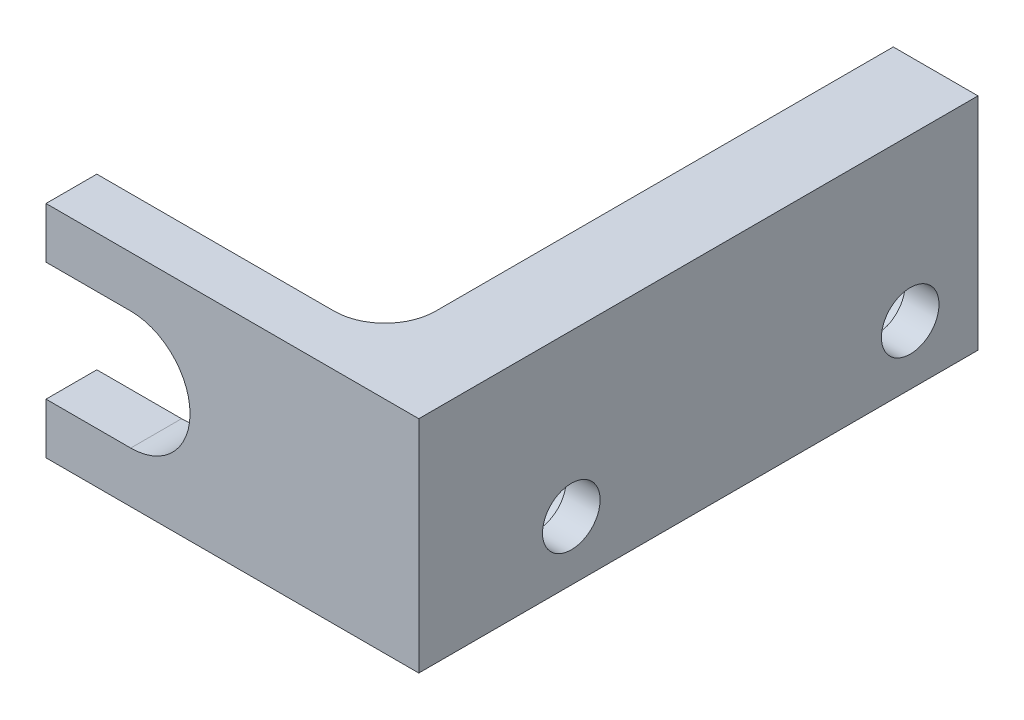
ISO-10303-21;
HEADER;
FILE_DESCRIPTION(('STEP AP214'),'2;1');
FILE_NAME('part.step','',(''),(''),'','','');
FILE_SCHEMA(('AUTOMOTIVE_DESIGN { 1 0 10303 214 1 1 1 1 }'));
ENDSEC;
DATA;
#1=APPLICATION_CONTEXT('core data for automotive mechanical design processes');
#2=APPLICATION_PROTOCOL_DEFINITION('international standard','automotive_design',2000,#1);
#3=PRODUCT_CONTEXT('',#1,'mechanical');
#4=PRODUCT('Part','Part','',(#3));
#5=PRODUCT_RELATED_PRODUCT_CATEGORY('part','',(#4));
#6=PRODUCT_DEFINITION_FORMATION('','',#4);
#7=PRODUCT_DEFINITION_CONTEXT('part definition',#1,'design');
#8=PRODUCT_DEFINITION('design','',#6,#7);
#9=PRODUCT_DEFINITION_SHAPE('','',#8);
#10=(LENGTH_UNIT() NAMED_UNIT(*) SI_UNIT(.MILLI.,.METRE.));
#11=(NAMED_UNIT(*) PLANE_ANGLE_UNIT() SI_UNIT($,.RADIAN.));
#12=(NAMED_UNIT(*) SI_UNIT($,.STERADIAN.) SOLID_ANGLE_UNIT());
#13=UNCERTAINTY_MEASURE_WITH_UNIT(LENGTH_MEASURE(1.E-05),#10,'distance_accuracy_value','');
#14=(GEOMETRIC_REPRESENTATION_CONTEXT(3) GLOBAL_UNCERTAINTY_ASSIGNED_CONTEXT((#13)) GLOBAL_UNIT_ASSIGNED_CONTEXT((#10,
#11,#12)) REPRESENTATION_CONTEXT('',''));
#15=CARTESIAN_POINT('',(0.,0.,0.));
#16=DIRECTION('',(0.,0.,1.));
#17=DIRECTION('',(1.,0.,0.));
#18=AXIS2_PLACEMENT_3D('',#15,#16,#17);
#19=CARTESIAN_POINT('',(-11.,-6.5,33.));
#20=DIRECTION('',(1.,0.,0.));
#21=DIRECTION('',(0.,0.,-1.));
#22=AXIS2_PLACEMENT_3D('',#19,#20,#21);
#23=PLANE('',#22);
#24=DIRECTION('',(0.,-1.,0.));
#25=VECTOR('',#24,1.);
#26=CARTESIAN_POINT('',(-11.,-6.5,33.));
#27=LINE('',#26,#25);
#28=CARTESIAN_POINT('',(-11.,-3.5,33.));
#29=VERTEX_POINT('',#28);
#30=CARTESIAN_POINT('',(-11.,-6.5,33.));
#31=VERTEX_POINT('',#30);
#32=EDGE_CURVE('E206',#29,#31,#27,.T.);
#33=ORIENTED_EDGE('',*,*,#32,.F.);
#34=DIRECTION('',(0.,0.,1.));
#35=VECTOR('',#34,1.);
#36=CARTESIAN_POINT('',(-11.,-3.5,0.));
#37=LINE('',#36,#35);
#38=CARTESIAN_POINT('',(-11.,-3.5,30.));
#39=VERTEX_POINT('',#38);
#40=EDGE_CURVE('E158',#39,#29,#37,.T.);
#41=ORIENTED_EDGE('',*,*,#40,.F.);
#42=DIRECTION('',(0.,1.,0.));
#43=VECTOR('',#42,1.);
#44=CARTESIAN_POINT('',(-11.,6.5,30.));
#45=LINE('',#44,#43);
#46=CARTESIAN_POINT('',(-11.,-6.5,30.));
#47=VERTEX_POINT('',#46);
#48=EDGE_CURVE('E192',#47,#39,#45,.T.);
#49=ORIENTED_EDGE('',*,*,#48,.F.);
#50=DIRECTION('',(0.,0.,-1.));
#51=VECTOR('',#50,1.);
#52=CARTESIAN_POINT('',(-11.,-6.5,33.));
#53=LINE('',#52,#51);
#54=EDGE_CURVE('E219',#31,#47,#53,.T.);
#55=ORIENTED_EDGE('',*,*,#54,.F.);
#56=EDGE_LOOP('',(#33,#41,#49,#55));
#57=FACE_BOUND('',#56,.T.);
#58=ADVANCED_FACE('F43',(#57),#23,.F.);
#59=CARTESIAN_POINT('',(0.,0.,0.));
#60=DIRECTION('',(0.,0.,-1.));
#61=DIRECTION('',(-1.,0.,0.));
#62=AXIS2_PLACEMENT_3D('',#59,#60,#61);
#63=PLANE('',#62);
#64=DIRECTION('',(1.,0.,0.));
#65=VECTOR('',#64,1.);
#66=CARTESIAN_POINT('',(-11.,-6.5,0.));
#67=LINE('',#66,#65);
#68=CARTESIAN_POINT('',(6.,-6.5,0.));
#69=VERTEX_POINT('',#68);
#70=CARTESIAN_POINT('',(11.,-6.5,0.));
#71=VERTEX_POINT('',#70);
#72=EDGE_CURVE('E204',#69,#71,#67,.T.);
#73=ORIENTED_EDGE('',*,*,#72,.F.);
#74=DIRECTION('',(0.,1.,0.));
#75=VECTOR('',#74,1.);
#76=CARTESIAN_POINT('',(6.,6.5,0.));
#77=LINE('',#76,#75);
#78=CARTESIAN_POINT('',(6.,6.5,0.));
#79=VERTEX_POINT('',#78);
#80=EDGE_CURVE('E187',#69,#79,#77,.T.);
#81=ORIENTED_EDGE('',*,*,#80,.T.);
#82=DIRECTION('',(-1.,0.,0.));
#83=VECTOR('',#82,1.);
#84=CARTESIAN_POINT('',(-11.,6.5,0.));
#85=LINE('',#84,#83);
#86=CARTESIAN_POINT('',(11.,6.5,0.));
#87=VERTEX_POINT('',#86);
#88=EDGE_CURVE('E213',#87,#79,#85,.T.);
#89=ORIENTED_EDGE('',*,*,#88,.F.);
#90=DIRECTION('',(0.,1.,0.));
#91=VECTOR('',#90,1.);
#92=CARTESIAN_POINT('',(11.,-6.5,0.));
#93=LINE('',#92,#91);
#94=EDGE_CURVE('E199',#71,#87,#93,.T.);
#95=ORIENTED_EDGE('',*,*,#94,.F.);
#96=EDGE_LOOP('',(#73,#81,#89,#95));
#97=FACE_BOUND('',#96,.T.);
#98=ADVANCED_FACE('F261',(#97),#63,.T.);
#99=CARTESIAN_POINT('',(11.,-6.5,33.));
#100=DIRECTION('',(-1.,0.,0.));
#101=DIRECTION('',(0.,0.,1.));
#102=AXIS2_PLACEMENT_3D('',#99,#100,#101);
#103=PLANE('',#102);
#104=CARTESIAN_POINT('',(11.,-3.,24.));
#105=DIRECTION('',(-1.,0.,0.));
#106=DIRECTION('',(0.,0.,1.));
#107=AXIS2_PLACEMENT_3D('',#104,#105,#106);
#108=CIRCLE('',#107,1.7);
#109=CARTESIAN_POINT('',(11.,-3.,25.7));
#110=VERTEX_POINT('',#109);
#111=EDGE_CURVE('E169',#110,#110,#108,.T.);
#112=ORIENTED_EDGE('',*,*,#111,.T.);
#113=EDGE_LOOP('',(#112));
#114=FACE_BOUND('',#113,.T.);
#115=CARTESIAN_POINT('',(11.,-3.,4.));
#116=DIRECTION('',(-1.,0.,0.));
#117=DIRECTION('',(0.,0.,1.));
#118=AXIS2_PLACEMENT_3D('',#115,#116,#117);
#119=CIRCLE('',#118,1.7);
#120=CARTESIAN_POINT('',(11.,-3.,5.7));
#121=VERTEX_POINT('',#120);
#122=EDGE_CURVE('E181',#121,#121,#119,.T.);
#123=ORIENTED_EDGE('',*,*,#122,.T.);
#124=EDGE_LOOP('',(#123));
#125=FACE_BOUND('',#124,.T.);
#126=ORIENTED_EDGE('',*,*,#94,.T.);
#127=DIRECTION('',(0.,0.,-1.));
#128=VECTOR('',#127,1.);
#129=CARTESIAN_POINT('',(11.,6.5,33.));
#130=LINE('',#129,#128);
#131=CARTESIAN_POINT('',(11.,6.5,33.));
#132=VERTEX_POINT('',#131);
#133=EDGE_CURVE('E225',#132,#87,#130,.T.);
#134=ORIENTED_EDGE('',*,*,#133,.F.);
#135=DIRECTION('',(0.,1.,0.));
#136=VECTOR('',#135,1.);
#137=CARTESIAN_POINT('',(11.,-6.5,33.));
#138=LINE('',#137,#136);
#139=CARTESIAN_POINT('',(11.,-6.5,33.));
#140=VERTEX_POINT('',#139);
#141=EDGE_CURVE('E200',#140,#132,#138,.T.);
#142=ORIENTED_EDGE('',*,*,#141,.F.);
#143=DIRECTION('',(0.,0.,-1.));
#144=VECTOR('',#143,1.);
#145=CARTESIAN_POINT('',(11.,-6.5,33.));
#146=LINE('',#145,#144);
#147=EDGE_CURVE('E210',#140,#71,#146,.T.);
#148=ORIENTED_EDGE('',*,*,#147,.T.);
#149=EDGE_LOOP('',(#126,#134,#142,#148));
#150=FACE_BOUND('',#149,.T.);
#151=ADVANCED_FACE('F268',(#114,#125,#150),#103,.F.);
#152=CARTESIAN_POINT('',(-11.,6.5,33.));
#153=DIRECTION('',(0.,-1.,0.));
#154=DIRECTION('',(0.,0.,-1.));
#155=AXIS2_PLACEMENT_3D('',#152,#153,#154);
#156=PLANE('',#155);
#157=DIRECTION('',(0.,0.,1.));
#158=VECTOR('',#157,1.);
#159=CARTESIAN_POINT('',(6.,6.5,0.));
#160=LINE('',#159,#158);
#161=CARTESIAN_POINT('',(6.,6.5,27.));
#162=VERTEX_POINT('',#161);
#163=EDGE_CURVE('E185',#79,#162,#160,.T.);
#164=ORIENTED_EDGE('',*,*,#163,.T.);
#165=CARTESIAN_POINT('',(3.,6.5,27.));
#166=DIRECTION('',(0.,-1.,0.));
#167=DIRECTION('',(0.,0.,-1.));
#168=AXIS2_PLACEMENT_3D('',#165,#166,#167);
#169=CIRCLE('',#168,3.);
#170=CARTESIAN_POINT('',(3.,6.5,30.));
#171=VERTEX_POINT('',#170);
#172=EDGE_CURVE('E12',#162,#171,#169,.T.);
#173=ORIENTED_EDGE('',*,*,#172,.T.);
#174=DIRECTION('',(-1.,0.,0.));
#175=VECTOR('',#174,1.);
#176=CARTESIAN_POINT('',(43.6955654485436,6.5,30.));
#177=LINE('',#176,#175);
#178=CARTESIAN_POINT('',(-11.,6.5,30.));
#179=VERTEX_POINT('',#178);
#180=EDGE_CURVE('E188',#171,#179,#177,.T.);
#181=ORIENTED_EDGE('',*,*,#180,.T.);
#182=DIRECTION('',(0.,0.,-1.));
#183=VECTOR('',#182,1.);
#184=CARTESIAN_POINT('',(-11.,6.5,33.));
#185=LINE('',#184,#183);
#186=CARTESIAN_POINT('',(-11.,6.5,33.));
#187=VERTEX_POINT('',#186);
#188=EDGE_CURVE('E222',#187,#179,#185,.T.);
#189=ORIENTED_EDGE('',*,*,#188,.F.);
#190=DIRECTION('',(-1.,0.,0.));
#191=VECTOR('',#190,1.);
#192=CARTESIAN_POINT('',(-11.,6.5,33.));
#193=LINE('',#192,#191);
#194=EDGE_CURVE('E203',#132,#187,#193,.T.);
#195=ORIENTED_EDGE('',*,*,#194,.F.);
#196=ORIENTED_EDGE('',*,*,#133,.T.);
#197=ORIENTED_EDGE('',*,*,#88,.T.);
#198=EDGE_LOOP('',(#164,#173,#181,#189,#195,#196,#197));
#199=FACE_BOUND('',#198,.T.);
#200=ADVANCED_FACE('F276',(#199),#156,.F.);
#201=CARTESIAN_POINT('',(-11.,3.5,30.));
#202=VERTEX_POINT('',#201);
#203=EDGE_CURVE('E184',#202,#179,#45,.T.);
#204=ORIENTED_EDGE('',*,*,#203,.F.);
#205=DIRECTION('',(0.,0.,1.));
#206=VECTOR('',#205,1.);
#207=CARTESIAN_POINT('',(-11.,3.5,0.));
#208=LINE('',#207,#206);
#209=CARTESIAN_POINT('',(-11.,3.5,33.));
#210=VERTEX_POINT('',#209);
#211=EDGE_CURVE('E137',#202,#210,#208,.T.);
#212=ORIENTED_EDGE('',*,*,#211,.T.);
#213=EDGE_CURVE('E152',#187,#210,#27,.T.);
#214=ORIENTED_EDGE('',*,*,#213,.F.);
#215=ORIENTED_EDGE('',*,*,#188,.T.);
#216=EDGE_LOOP('',(#204,#212,#214,#215));
#217=FACE_BOUND('',#216,.T.);
#218=ADVANCED_FACE('F264',(#217),#23,.F.);
#219=CARTESIAN_POINT('',(-11.,-6.5,33.));
#220=DIRECTION('',(0.,1.,0.));
#221=DIRECTION('',(0.,0.,1.));
#222=AXIS2_PLACEMENT_3D('',#219,#220,#221);
#223=PLANE('',#222);
#224=ORIENTED_EDGE('',*,*,#54,.T.);
#225=DIRECTION('',(-1.,0.,0.));
#226=VECTOR('',#225,1.);
#227=CARTESIAN_POINT('',(43.6955654485436,-6.5,30.));
#228=LINE('',#227,#226);
#229=CARTESIAN_POINT('',(3.,-6.5,30.));
#230=VERTEX_POINT('',#229);
#231=EDGE_CURVE('E195',#230,#47,#228,.T.);
#232=ORIENTED_EDGE('',*,*,#231,.F.);
#233=CARTESIAN_POINT('',(3.,-6.5,27.));
#234=DIRECTION('',(0.,1.,0.));
#235=DIRECTION('',(0.,0.,1.));
#236=AXIS2_PLACEMENT_3D('',#233,#234,#235);
#237=CIRCLE('',#236,3.);
#238=CARTESIAN_POINT('',(6.,-6.5,27.));
#239=VERTEX_POINT('',#238);
#240=EDGE_CURVE('E51',#230,#239,#237,.T.);
#241=ORIENTED_EDGE('',*,*,#240,.T.);
#242=DIRECTION('',(0.,0.,-1.));
#243=VECTOR('',#242,1.);
#244=CARTESIAN_POINT('',(6.,-6.5,0.));
#245=LINE('',#244,#243);
#246=EDGE_CURVE('E191',#239,#69,#245,.T.);
#247=ORIENTED_EDGE('',*,*,#246,.T.);
#248=ORIENTED_EDGE('',*,*,#72,.T.);
#249=ORIENTED_EDGE('',*,*,#147,.F.);
#250=DIRECTION('',(1.,0.,0.));
#251=VECTOR('',#250,1.);
#252=CARTESIAN_POINT('',(-11.,-6.5,33.));
#253=LINE('',#252,#251);
#254=EDGE_CURVE('E208',#31,#140,#253,.T.);
#255=ORIENTED_EDGE('',*,*,#254,.F.);
#256=EDGE_LOOP('',(#224,#232,#241,#247,#248,#249,#255));
#257=FACE_BOUND('',#256,.T.);
#258=ADVANCED_FACE('F275',(#257),#223,.F.);
#259=CARTESIAN_POINT('',(0.,0.,33.));
#260=DIRECTION('',(0.,0.,-1.));
#261=DIRECTION('',(-1.,0.,0.));
#262=AXIS2_PLACEMENT_3D('',#259,#260,#261);
#263=PLANE('',#262);
#264=CARTESIAN_POINT('',(-6.,0.,33.));
#265=DIRECTION('',(0.,0.,1.));
#266=DIRECTION('',(-1.,0.,0.));
#267=AXIS2_PLACEMENT_3D('',#264,#265,#266);
#268=CIRCLE('',#267,3.5);
#269=CARTESIAN_POINT('',(-6.,-3.5,33.));
#270=VERTEX_POINT('',#269);
#271=CARTESIAN_POINT('',(-6.,3.5,33.));
#272=VERTEX_POINT('',#271);
#273=EDGE_CURVE('E141',#270,#272,#268,.T.);
#274=ORIENTED_EDGE('',*,*,#273,.F.);
#275=DIRECTION('',(1.,0.,0.));
#276=VECTOR('',#275,1.);
#277=CARTESIAN_POINT('',(-11.,-3.5,33.));
#278=LINE('',#277,#276);
#279=EDGE_CURVE('E138',#29,#270,#278,.T.);
#280=ORIENTED_EDGE('',*,*,#279,.F.);
#281=ORIENTED_EDGE('',*,*,#32,.T.);
#282=ORIENTED_EDGE('',*,*,#254,.T.);
#283=ORIENTED_EDGE('',*,*,#141,.T.);
#284=ORIENTED_EDGE('',*,*,#194,.T.);
#285=ORIENTED_EDGE('',*,*,#213,.T.);
#286=DIRECTION('',(-1.,0.,0.));
#287=VECTOR('',#286,1.);
#288=CARTESIAN_POINT('',(-11.,3.5,33.));
#289=LINE('',#288,#287);
#290=EDGE_CURVE('E131',#272,#210,#289,.T.);
#291=ORIENTED_EDGE('',*,*,#290,.F.);
#292=EDGE_LOOP('',(#274,#280,#281,#282,#283,#284,#285,#291));
#293=FACE_BOUND('',#292,.T.);
#294=ADVANCED_FACE('F150',(#293),#263,.F.);
#295=CARTESIAN_POINT('',(43.6955654485436,6.5,30.));
#296=DIRECTION('',(0.,0.,1.));
#297=DIRECTION('',(1.,0.,0.));
#298=AXIS2_PLACEMENT_3D('',#295,#296,#297);
#299=PLANE('',#298);
#300=ORIENTED_EDGE('',*,*,#180,.F.);
#301=DIRECTION('',(0.,-1.,0.));
#302=VECTOR('',#301,1.);
#303=CARTESIAN_POINT('',(3.,6.5,30.));
#304=LINE('',#303,#302);
#305=EDGE_CURVE('E234',#171,#230,#304,.T.);
#306=ORIENTED_EDGE('',*,*,#305,.T.);
#307=ORIENTED_EDGE('',*,*,#231,.T.);
#308=ORIENTED_EDGE('',*,*,#48,.T.);
#309=DIRECTION('',(1.,0.,0.));
#310=VECTOR('',#309,1.);
#311=CARTESIAN_POINT('',(43.6955654485436,-3.5,30.));
#312=LINE('',#311,#310);
#313=CARTESIAN_POINT('',(-6.,-3.5,30.));
#314=VERTEX_POINT('',#313);
#315=EDGE_CURVE('E231',#39,#314,#312,.T.);
#316=ORIENTED_EDGE('',*,*,#315,.T.);
#317=CARTESIAN_POINT('',(-6.,0.,30.));
#318=DIRECTION('',(0.,0.,1.));
#319=DIRECTION('',(1.,0.,0.));
#320=AXIS2_PLACEMENT_3D('',#317,#318,#319);
#321=CIRCLE('',#320,3.5);
#322=CARTESIAN_POINT('',(-6.,3.5,30.));
#323=VERTEX_POINT('',#322);
#324=EDGE_CURVE('E229',#314,#323,#321,.T.);
#325=ORIENTED_EDGE('',*,*,#324,.T.);
#326=DIRECTION('',(-1.,0.,0.));
#327=VECTOR('',#326,1.);
#328=CARTESIAN_POINT('',(43.6955654485436,3.5,30.));
#329=LINE('',#328,#327);
#330=EDGE_CURVE('E134',#323,#202,#329,.T.);
#331=ORIENTED_EDGE('',*,*,#330,.T.);
#332=ORIENTED_EDGE('',*,*,#203,.T.);
#333=EDGE_LOOP('',(#300,#306,#307,#308,#316,#325,#331,#332));
#334=FACE_BOUND('',#333,.T.);
#335=ADVANCED_FACE('F288',(#334),#299,.F.);
#336=CARTESIAN_POINT('',(6.,-6.5,33.));
#337=DIRECTION('',(-1.,0.,0.));
#338=DIRECTION('',(0.,0.,1.));
#339=AXIS2_PLACEMENT_3D('',#336,#337,#338);
#340=PLANE('',#339);
#341=ORIENTED_EDGE('',*,*,#246,.F.);
#342=DIRECTION('',(0.,-1.,0.));
#343=VECTOR('',#342,1.);
#344=CARTESIAN_POINT('',(6.,-6.5,27.));
#345=LINE('',#344,#343);
#346=CARTESIAN_POINT('',(6.,-3.,27.));
#347=VERTEX_POINT('',#346);
#348=EDGE_CURVE('E238',#239,#347,#345,.F.);
#349=ORIENTED_EDGE('',*,*,#348,.T.);
#350=CARTESIAN_POINT('',(6.,-3.,24.));
#351=DIRECTION('',(-1.,0.,0.));
#352=DIRECTION('',(0.,0.,1.));
#353=AXIS2_PLACEMENT_3D('',#350,#351,#352);
#354=CIRCLE('',#353,3.);
#355=EDGE_CURVE('E157',#347,#347,#354,.T.);
#356=ORIENTED_EDGE('',*,*,#355,.F.);
#357=DIRECTION('',(0.,-1.,0.));
#358=VECTOR('',#357,1.);
#359=CARTESIAN_POINT('',(6.,-6.5,27.));
#360=LINE('',#359,#358);
#361=EDGE_CURVE('E58',#347,#162,#360,.F.);
#362=ORIENTED_EDGE('',*,*,#361,.T.);
#363=ORIENTED_EDGE('',*,*,#163,.F.);
#364=ORIENTED_EDGE('',*,*,#80,.F.);
#365=EDGE_LOOP('',(#341,#349,#356,#362,#363,#364));
#366=FACE_BOUND('',#365,.T.);
#367=CARTESIAN_POINT('',(6.,-3.,4.));
#368=DIRECTION('',(-1.,0.,0.));
#369=DIRECTION('',(0.,0.,1.));
#370=AXIS2_PLACEMENT_3D('',#367,#368,#369);
#371=CIRCLE('',#370,3.);
#372=CARTESIAN_POINT('',(6.,-3.,7.));
#373=VERTEX_POINT('',#372);
#374=EDGE_CURVE('E172',#373,#373,#371,.T.);
#375=ORIENTED_EDGE('',*,*,#374,.F.);
#376=EDGE_LOOP('',(#375));
#377=FACE_BOUND('',#376,.T.);
#378=ADVANCED_FACE('F240',(#366,#377),#340,.T.);
#379=CARTESIAN_POINT('',(6.,-3.,4.));
#380=DIRECTION('',(-1.,0.,0.));
#381=DIRECTION('',(0.,0.,1.));
#382=AXIS2_PLACEMENT_3D('',#379,#380,#381);
#383=CYLINDRICAL_SURFACE('',#382,1.7);
#384=ORIENTED_EDGE('',*,*,#122,.F.);
#385=EDGE_LOOP('',(#384));
#386=FACE_BOUND('',#385,.T.);
#387=CARTESIAN_POINT('',(9.,-3.,4.));
#388=DIRECTION('',(-1.,0.,0.));
#389=DIRECTION('',(0.,0.,1.));
#390=AXIS2_PLACEMENT_3D('',#387,#388,#389);
#391=CIRCLE('',#390,1.7);
#392=CARTESIAN_POINT('',(9.,-3.,5.7));
#393=VERTEX_POINT('',#392);
#394=EDGE_CURVE('E178',#393,#393,#391,.T.);
#395=ORIENTED_EDGE('',*,*,#394,.T.);
#396=EDGE_LOOP('',(#395));
#397=FACE_BOUND('',#396,.T.);
#398=ADVANCED_FACE('F371',(#386,#397),#383,.F.);
#399=CARTESIAN_POINT('',(9.,-1.3,4.));
#400=DIRECTION('',(1.,0.,0.));
#401=DIRECTION('',(0.,0.,-1.));
#402=AXIS2_PLACEMENT_3D('',#399,#400,#401);
#403=PLANE('',#402);
#404=ORIENTED_EDGE('',*,*,#394,.F.);
#405=EDGE_LOOP('',(#404));
#406=FACE_BOUND('',#405,.T.);
#407=CARTESIAN_POINT('',(9.,-3.,4.));
#408=DIRECTION('',(-1.,0.,0.));
#409=DIRECTION('',(0.,0.,1.));
#410=AXIS2_PLACEMENT_3D('',#407,#408,#409);
#411=CIRCLE('',#410,3.);
#412=CARTESIAN_POINT('',(9.,-3.,7.));
#413=VERTEX_POINT('',#412);
#414=EDGE_CURVE('E175',#413,#413,#411,.T.);
#415=ORIENTED_EDGE('',*,*,#414,.T.);
#416=EDGE_LOOP('',(#415));
#417=FACE_BOUND('',#416,.T.);
#418=ADVANCED_FACE('F361',(#406,#417),#403,.F.);
#419=CARTESIAN_POINT('',(6.,-3.,4.));
#420=DIRECTION('',(-1.,0.,0.));
#421=DIRECTION('',(0.,0.,1.));
#422=AXIS2_PLACEMENT_3D('',#419,#420,#421);
#423=CYLINDRICAL_SURFACE('',#422,3.);
#424=ORIENTED_EDGE('',*,*,#414,.F.);
#425=EDGE_LOOP('',(#424));
#426=FACE_BOUND('',#425,.T.);
#427=ORIENTED_EDGE('',*,*,#374,.T.);
#428=EDGE_LOOP('',(#427));
#429=FACE_BOUND('',#428,.T.);
#430=ADVANCED_FACE('F351',(#426,#429),#423,.F.);
#431=CARTESIAN_POINT('',(6.,-3.,24.));
#432=DIRECTION('',(-1.,0.,0.));
#433=DIRECTION('',(0.,0.,1.));
#434=AXIS2_PLACEMENT_3D('',#431,#432,#433);
#435=CYLINDRICAL_SURFACE('',#434,1.7);
#436=ORIENTED_EDGE('',*,*,#111,.F.);
#437=EDGE_LOOP('',(#436));
#438=FACE_BOUND('',#437,.T.);
#439=CARTESIAN_POINT('',(9.,-3.,24.));
#440=DIRECTION('',(-1.,0.,0.));
#441=DIRECTION('',(0.,0.,1.));
#442=AXIS2_PLACEMENT_3D('',#439,#440,#441);
#443=CIRCLE('',#442,1.7);
#444=CARTESIAN_POINT('',(9.,-3.,25.7));
#445=VERTEX_POINT('',#444);
#446=EDGE_CURVE('E166',#445,#445,#443,.T.);
#447=ORIENTED_EDGE('',*,*,#446,.T.);
#448=EDGE_LOOP('',(#447));
#449=FACE_BOUND('',#448,.T.);
#450=ADVANCED_FACE('F256',(#438,#449),#435,.F.);
#451=CARTESIAN_POINT('',(9.,-1.3,24.));
#452=DIRECTION('',(1.,0.,0.));
#453=DIRECTION('',(0.,0.,-1.));
#454=AXIS2_PLACEMENT_3D('',#451,#452,#453);
#455=PLANE('',#454);
#456=ORIENTED_EDGE('',*,*,#446,.F.);
#457=EDGE_LOOP('',(#456));
#458=FACE_BOUND('',#457,.T.);
#459=CARTESIAN_POINT('',(9.,-3.,24.));
#460=DIRECTION('',(-1.,0.,0.));
#461=DIRECTION('',(0.,0.,1.));
#462=AXIS2_PLACEMENT_3D('',#459,#460,#461);
#463=CIRCLE('',#462,3.);
#464=CARTESIAN_POINT('',(9.,-3.,27.));
#465=VERTEX_POINT('',#464);
#466=EDGE_CURVE('E163',#465,#465,#463,.T.);
#467=ORIENTED_EDGE('',*,*,#466,.T.);
#468=EDGE_LOOP('',(#467));
#469=FACE_BOUND('',#468,.T.);
#470=ADVANCED_FACE('F247',(#458,#469),#455,.F.);
#471=CARTESIAN_POINT('',(6.,-3.,24.));
#472=DIRECTION('',(-1.,0.,0.));
#473=DIRECTION('',(0.,0.,1.));
#474=AXIS2_PLACEMENT_3D('',#471,#472,#473);
#475=CYLINDRICAL_SURFACE('',#474,3.);
#476=ORIENTED_EDGE('',*,*,#466,.F.);
#477=EDGE_LOOP('',(#476));
#478=FACE_BOUND('',#477,.T.);
#479=ORIENTED_EDGE('',*,*,#355,.T.);
#480=EDGE_LOOP('',(#479));
#481=FACE_BOUND('',#480,.T.);
#482=ADVANCED_FACE('F245',(#478,#481),#475,.F.);
#483=CARTESIAN_POINT('',(-6.,0.,0.));
#484=DIRECTION('',(0.,0.,1.));
#485=DIRECTION('',(1.,0.,0.));
#486=AXIS2_PLACEMENT_3D('',#483,#484,#485);
#487=CYLINDRICAL_SURFACE('',#486,3.5);
#488=DIRECTION('',(0.,0.,1.));
#489=VECTOR('',#488,1.);
#490=CARTESIAN_POINT('',(-6.,-3.5,0.));
#491=LINE('',#490,#489);
#492=EDGE_CURVE('E144',#314,#270,#491,.T.);
#493=ORIENTED_EDGE('',*,*,#492,.T.);
#494=ORIENTED_EDGE('',*,*,#273,.T.);
#495=DIRECTION('',(0.,0.,1.));
#496=VECTOR('',#495,1.);
#497=CARTESIAN_POINT('',(-6.,3.5,0.));
#498=LINE('',#497,#496);
#499=EDGE_CURVE('E127',#323,#272,#498,.T.);
#500=ORIENTED_EDGE('',*,*,#499,.F.);
#501=ORIENTED_EDGE('',*,*,#324,.F.);
#502=EDGE_LOOP('',(#493,#494,#500,#501));
#503=FACE_BOUND('',#502,.T.);
#504=ADVANCED_FACE('F142',(#503),#487,.F.);
#505=CARTESIAN_POINT('',(-11.,-3.5,0.));
#506=DIRECTION('',(0.,-1.,0.));
#507=DIRECTION('',(0.,0.,-1.));
#508=AXIS2_PLACEMENT_3D('',#505,#506,#507);
#509=PLANE('',#508);
#510=ORIENTED_EDGE('',*,*,#40,.T.);
#511=ORIENTED_EDGE('',*,*,#279,.T.);
#512=ORIENTED_EDGE('',*,*,#492,.F.);
#513=ORIENTED_EDGE('',*,*,#315,.F.);
#514=EDGE_LOOP('',(#510,#511,#512,#513));
#515=FACE_BOUND('',#514,.T.);
#516=ADVANCED_FACE('F254',(#515),#509,.F.);
#517=CARTESIAN_POINT('',(-11.,3.5,0.));
#518=DIRECTION('',(0.,1.,0.));
#519=DIRECTION('',(0.,0.,1.));
#520=AXIS2_PLACEMENT_3D('',#517,#518,#519);
#521=PLANE('',#520);
#522=ORIENTED_EDGE('',*,*,#499,.T.);
#523=ORIENTED_EDGE('',*,*,#290,.T.);
#524=ORIENTED_EDGE('',*,*,#211,.F.);
#525=ORIENTED_EDGE('',*,*,#330,.F.);
#526=EDGE_LOOP('',(#522,#523,#524,#525));
#527=FACE_BOUND('',#526,.T.);
#528=ADVANCED_FACE('F129',(#527),#521,.F.);
#529=CARTESIAN_POINT('',(3.,6.5,27.));
#530=DIRECTION('',(0.,-1.,0.));
#531=DIRECTION('',(0.,0.,-1.));
#532=AXIS2_PLACEMENT_3D('',#529,#530,#531);
#533=CYLINDRICAL_SURFACE('',#532,3.);
#534=ORIENTED_EDGE('',*,*,#361,.F.);
#535=ORIENTED_EDGE('',*,*,#348,.F.);
#536=ORIENTED_EDGE('',*,*,#240,.F.);
#537=ORIENTED_EDGE('',*,*,#305,.F.);
#538=ORIENTED_EDGE('',*,*,#172,.F.);
#539=EDGE_LOOP('',(#534,#535,#536,#537,#538));
#540=FACE_BOUND('',#539,.T.);
#541=ADVANCED_FACE('F45',(#540),#533,.F.);
#542=CLOSED_SHELL('',(#58,#98,#151,#200,#218,#258,#294,#335,#378,#398,#418,#430,#450,#470,#482,
#504,#516,#528,#541));
#543=MANIFOLD_SOLID_BREP('B2',#542);
#544=ADVANCED_BREP_SHAPE_REPRESENTATION('',(#18,#543),#14);
#545=SHAPE_DEFINITION_REPRESENTATION(#9,#544);
ENDSEC;
END-ISO-10303-21;
